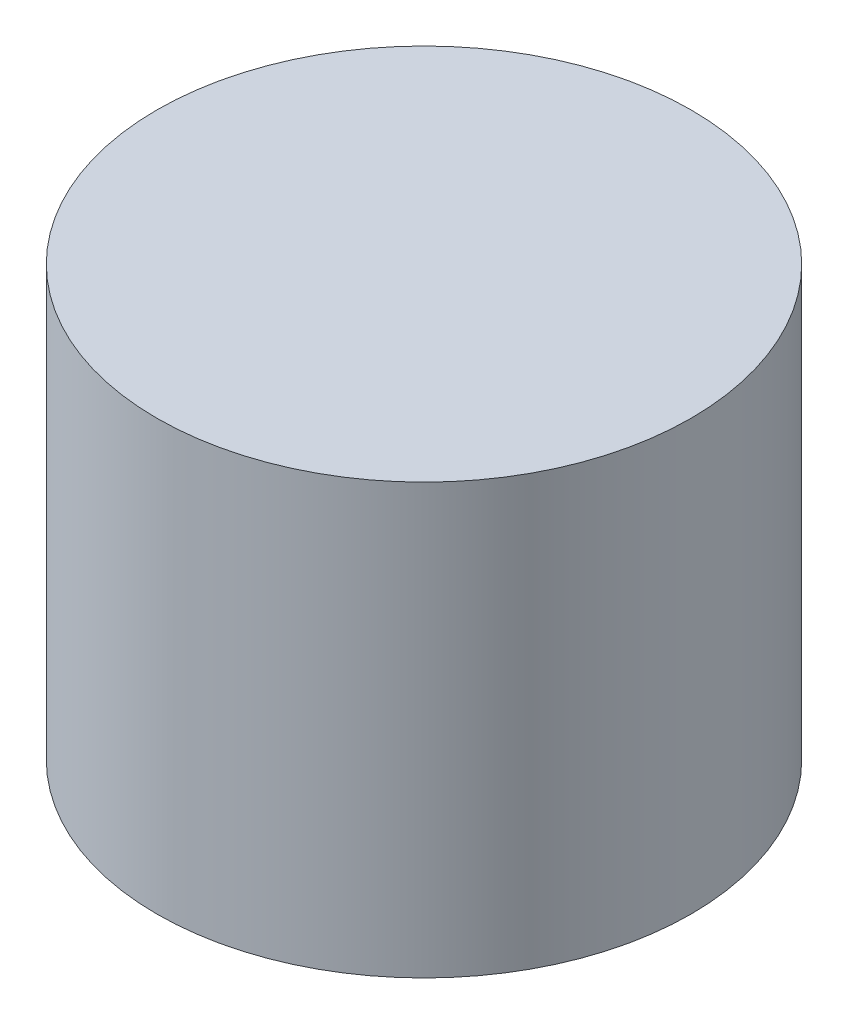
ISO-10303-21;
HEADER;
FILE_DESCRIPTION(('STEP AP214'),'2;1');
FILE_NAME('part.step','',(''),(''),'','','');
FILE_SCHEMA(('AUTOMOTIVE_DESIGN { 1 0 10303 214 1 1 1 1 }'));
ENDSEC;
DATA;
#1=APPLICATION_CONTEXT('core data for automotive mechanical design processes');
#2=APPLICATION_PROTOCOL_DEFINITION('international standard','automotive_design',2000,#1);
#3=PRODUCT_CONTEXT('',#1,'mechanical');
#4=PRODUCT('Part','Part','',(#3));
#5=PRODUCT_RELATED_PRODUCT_CATEGORY('part','',(#4));
#6=PRODUCT_DEFINITION_FORMATION('','',#4);
#7=PRODUCT_DEFINITION_CONTEXT('part definition',#1,'design');
#8=PRODUCT_DEFINITION('design','',#6,#7);
#9=PRODUCT_DEFINITION_SHAPE('','',#8);
#10=(LENGTH_UNIT() NAMED_UNIT(*) SI_UNIT(.MILLI.,.METRE.));
#11=(NAMED_UNIT(*) PLANE_ANGLE_UNIT() SI_UNIT($,.RADIAN.));
#12=(NAMED_UNIT(*) SI_UNIT($,.STERADIAN.) SOLID_ANGLE_UNIT());
#13=UNCERTAINTY_MEASURE_WITH_UNIT(LENGTH_MEASURE(1.E-05),#10,'distance_accuracy_value','');
#14=(GEOMETRIC_REPRESENTATION_CONTEXT(3) GLOBAL_UNCERTAINTY_ASSIGNED_CONTEXT((#13)) GLOBAL_UNIT_ASSIGNED_CONTEXT((#10,
#11,#12)) REPRESENTATION_CONTEXT('',''));
#15=CARTESIAN_POINT('',(0.,0.,0.));
#16=DIRECTION('',(0.,0.,1.));
#17=DIRECTION('',(1.,0.,0.));
#18=AXIS2_PLACEMENT_3D('',#15,#16,#17);
#19=CARTESIAN_POINT('',(0.,20.5,0.));
#20=DIRECTION('',(0.,-1.,0.));
#21=DIRECTION('',(0.,0.,1.));
#22=AXIS2_PLACEMENT_3D('',#19,#20,#21);
#23=CYLINDRICAL_SURFACE('',#22,12.75);
#24=CARTESIAN_POINT('',(0.,20.5,0.));
#25=DIRECTION('',(0.,-1.,0.));
#26=DIRECTION('',(0.,0.,-1.));
#27=AXIS2_PLACEMENT_3D('',#24,#25,#26);
#28=CIRCLE('',#27,12.75);
#29=CARTESIAN_POINT('',(0.,20.5,-12.75));
#30=VERTEX_POINT('',#29);
#31=EDGE_CURVE('E10',#30,#30,#28,.T.);
#32=ORIENTED_EDGE('',*,*,#31,.T.);
#33=EDGE_LOOP('',(#32));
#34=FACE_BOUND('',#33,.T.);
#35=CARTESIAN_POINT('',(0.,0.,0.));
#36=DIRECTION('',(0.,-1.,0.));
#37=DIRECTION('',(0.,0.,-1.));
#38=AXIS2_PLACEMENT_3D('',#35,#36,#37);
#39=CIRCLE('',#38,12.75);
#40=CARTESIAN_POINT('',(0.,0.,-12.75));
#41=VERTEX_POINT('',#40);
#42=EDGE_CURVE('E44',#41,#41,#39,.T.);
#43=ORIENTED_EDGE('',*,*,#42,.F.);
#44=EDGE_LOOP('',(#43));
#45=FACE_BOUND('',#44,.T.);
#46=ADVANCED_FACE('F41',(#34,#45),#23,.T.);
#47=CARTESIAN_POINT('',(0.,20.5,0.));
#48=DIRECTION('',(0.,1.,0.));
#49=DIRECTION('',(0.,0.,-1.));
#50=AXIS2_PLACEMENT_3D('',#47,#48,#49);
#51=PLANE('',#50);
#52=ORIENTED_EDGE('',*,*,#31,.F.);
#53=EDGE_LOOP('',(#52));
#54=FACE_BOUND('',#53,.T.);
#55=ADVANCED_FACE('F56',(#54),#51,.T.);
#56=CARTESIAN_POINT('',(0.,0.,0.));
#57=DIRECTION('',(0.,1.,0.));
#58=DIRECTION('',(0.,0.,-1.));
#59=AXIS2_PLACEMENT_3D('',#56,#57,#58);
#60=PLANE('',#59);
#61=ORIENTED_EDGE('',*,*,#42,.T.);
#62=EDGE_LOOP('',(#61));
#63=FACE_BOUND('',#62,.T.);
#64=ADVANCED_FACE('F53',(#63),#60,.F.);
#65=CLOSED_SHELL('',(#46,#55,#64));
#66=MANIFOLD_SOLID_BREP('B2',#65);
#67=ADVANCED_BREP_SHAPE_REPRESENTATION('',(#18,#66),#14);
#68=SHAPE_DEFINITION_REPRESENTATION(#9,#67);
ENDSEC;
END-ISO-10303-21;
